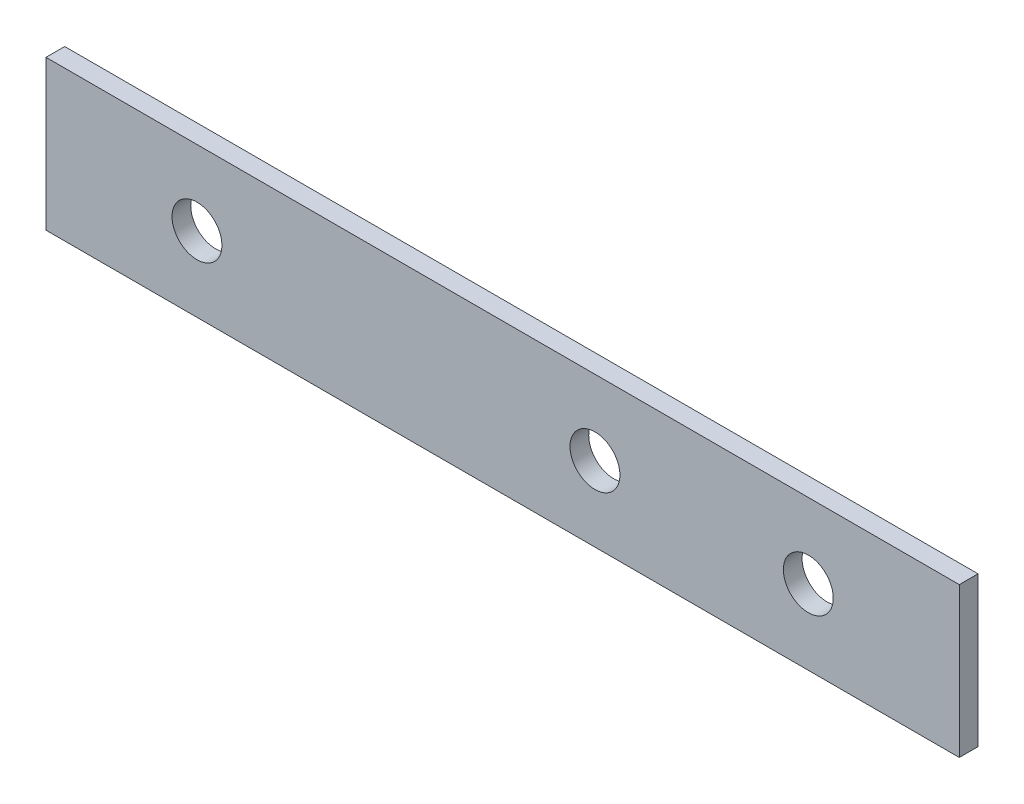
ISO-10303-21;
HEADER;
FILE_DESCRIPTION(('STEP AP214'),'2;1');
FILE_NAME('part.step','',(''),(''),'','','');
FILE_SCHEMA(('AUTOMOTIVE_DESIGN { 1 0 10303 214 1 1 1 1 }'));
ENDSEC;
DATA;
#1=APPLICATION_CONTEXT('core data for automotive mechanical design processes');
#2=APPLICATION_PROTOCOL_DEFINITION('international standard','automotive_design',2000,#1);
#3=PRODUCT_CONTEXT('',#1,'mechanical');
#4=PRODUCT('Part','Part','',(#3));
#5=PRODUCT_RELATED_PRODUCT_CATEGORY('part','',(#4));
#6=PRODUCT_DEFINITION_FORMATION('','',#4);
#7=PRODUCT_DEFINITION_CONTEXT('part definition',#1,'design');
#8=PRODUCT_DEFINITION('design','',#6,#7);
#9=PRODUCT_DEFINITION_SHAPE('','',#8);
#10=(LENGTH_UNIT() NAMED_UNIT(*) SI_UNIT(.MILLI.,.METRE.));
#11=(NAMED_UNIT(*) PLANE_ANGLE_UNIT() SI_UNIT($,.RADIAN.));
#12=(NAMED_UNIT(*) SI_UNIT($,.STERADIAN.) SOLID_ANGLE_UNIT());
#13=UNCERTAINTY_MEASURE_WITH_UNIT(LENGTH_MEASURE(1.E-05),#10,'distance_accuracy_value','');
#14=(GEOMETRIC_REPRESENTATION_CONTEXT(3) GLOBAL_UNCERTAINTY_ASSIGNED_CONTEXT((#13)) GLOBAL_UNIT_ASSIGNED_CONTEXT((#10,
#11,#12)) REPRESENTATION_CONTEXT('',''));
#15=CARTESIAN_POINT('',(0.,0.,0.));
#16=DIRECTION('',(0.,0.,1.));
#17=DIRECTION('',(1.,0.,0.));
#18=AXIS2_PLACEMENT_3D('',#15,#16,#17);
#19=CARTESIAN_POINT('',(0.,0.,4.7625));
#20=DIRECTION('',(0.,0.,-1.));
#21=DIRECTION('',(-1.,0.,0.));
#22=AXIS2_PLACEMENT_3D('',#19,#20,#21);
#23=PLANE('',#22);
#24=DIRECTION('',(0.,-1.,0.));
#25=VECTOR('',#24,1.);
#26=CARTESIAN_POINT('',(0.,0.,4.7625));
#27=LINE('',#26,#25);
#28=CARTESIAN_POINT('',(0.,38.1,4.7625));
#29=VERTEX_POINT('',#28);
#30=CARTESIAN_POINT('',(0.,0.,4.7625));
#31=VERTEX_POINT('',#30);
#32=EDGE_CURVE('E96',#29,#31,#27,.T.);
#33=ORIENTED_EDGE('',*,*,#32,.T.);
#34=DIRECTION('',(1.,0.,0.));
#35=VECTOR('',#34,1.);
#36=CARTESIAN_POINT('',(0.,0.,4.7625));
#37=LINE('',#36,#35);
#38=CARTESIAN_POINT('',(232.41,0.,4.7625));
#39=VERTEX_POINT('',#38);
#40=EDGE_CURVE('E91',#31,#39,#37,.T.);
#41=ORIENTED_EDGE('',*,*,#40,.T.);
#42=DIRECTION('',(0.,1.,0.));
#43=VECTOR('',#42,1.);
#44=CARTESIAN_POINT('',(232.41,0.,4.7625));
#45=LINE('',#44,#43);
#46=CARTESIAN_POINT('',(232.41,38.1,4.7625));
#47=VERTEX_POINT('',#46);
#48=EDGE_CURVE('E94',#39,#47,#45,.T.);
#49=ORIENTED_EDGE('',*,*,#48,.T.);
#50=DIRECTION('',(-1.,0.,0.));
#51=VECTOR('',#50,1.);
#52=CARTESIAN_POINT('',(0.,38.1,4.7625));
#53=LINE('',#52,#51);
#54=EDGE_CURVE('E61',#47,#29,#53,.T.);
#55=ORIENTED_EDGE('',*,*,#54,.T.);
#56=EDGE_LOOP('',(#33,#41,#49,#55));
#57=FACE_BOUND('',#56,.T.);
#58=CARTESIAN_POINT('',(38.4175,19.05,4.7625));
#59=DIRECTION('',(0.,0.,1.));
#60=DIRECTION('',(1.,0.,0.));
#61=AXIS2_PLACEMENT_3D('',#58,#59,#60);
#62=CIRCLE('',#61,6.35);
#63=CARTESIAN_POINT('',(32.0675,19.05,4.7625));
#64=VERTEX_POINT('',#63);
#65=EDGE_CURVE('E116',#64,#64,#62,.T.);
#66=ORIENTED_EDGE('',*,*,#65,.F.);
#67=EDGE_LOOP('',(#66));
#68=FACE_BOUND('',#67,.T.);
#69=CARTESIAN_POINT('',(193.9925,19.05,4.7625));
#70=DIRECTION('',(0.,0.,1.));
#71=DIRECTION('',(1.,0.,0.));
#72=AXIS2_PLACEMENT_3D('',#69,#70,#71);
#73=CIRCLE('',#72,6.35);
#74=CARTESIAN_POINT('',(187.6425,19.05,4.7625));
#75=VERTEX_POINT('',#74);
#76=EDGE_CURVE('E138',#75,#75,#73,.T.);
#77=ORIENTED_EDGE('',*,*,#76,.F.);
#78=EDGE_LOOP('',(#77));
#79=FACE_BOUND('',#78,.T.);
#80=CARTESIAN_POINT('',(139.7,19.05,4.7625));
#81=DIRECTION('',(0.,0.,1.));
#82=DIRECTION('',(1.,0.,0.));
#83=AXIS2_PLACEMENT_3D('',#80,#81,#82);
#84=CIRCLE('',#83,6.35);
#85=CARTESIAN_POINT('',(133.35,19.05,4.7625));
#86=VERTEX_POINT('',#85);
#87=EDGE_CURVE('E146',#86,#86,#84,.T.);
#88=ORIENTED_EDGE('',*,*,#87,.F.);
#89=EDGE_LOOP('',(#88));
#90=FACE_BOUND('',#89,.T.);
#91=ADVANCED_FACE('F43',(#57,#68,#79,#90),#23,.F.);
#92=CARTESIAN_POINT('',(0.,0.,0.));
#93=DIRECTION('',(0.,0.,-1.));
#94=DIRECTION('',(-1.,0.,0.));
#95=AXIS2_PLACEMENT_3D('',#92,#93,#94);
#96=PLANE('',#95);
#97=CARTESIAN_POINT('',(193.9925,19.05,0.));
#98=DIRECTION('',(0.,0.,1.));
#99=DIRECTION('',(1.,0.,0.));
#100=AXIS2_PLACEMENT_3D('',#97,#98,#99);
#101=CIRCLE('',#100,6.35);
#102=CARTESIAN_POINT('',(187.6425,19.05,0.));
#103=VERTEX_POINT('',#102);
#104=EDGE_CURVE('E142',#103,#103,#101,.T.);
#105=ORIENTED_EDGE('',*,*,#104,.T.);
#106=EDGE_LOOP('',(#105));
#107=FACE_BOUND('',#106,.T.);
#108=DIRECTION('',(0.,-1.,0.));
#109=VECTOR('',#108,1.);
#110=CARTESIAN_POINT('',(0.,0.,0.));
#111=LINE('',#110,#109);
#112=CARTESIAN_POINT('',(0.,38.1,0.));
#113=VERTEX_POINT('',#112);
#114=CARTESIAN_POINT('',(0.,0.,0.));
#115=VERTEX_POINT('',#114);
#116=EDGE_CURVE('E112',#113,#115,#111,.T.);
#117=ORIENTED_EDGE('',*,*,#116,.F.);
#118=DIRECTION('',(-1.,0.,0.));
#119=VECTOR('',#118,1.);
#120=CARTESIAN_POINT('',(0.,38.1,0.));
#121=LINE('',#120,#119);
#122=CARTESIAN_POINT('',(232.41,38.1,0.));
#123=VERTEX_POINT('',#122);
#124=EDGE_CURVE('E84',#123,#113,#121,.T.);
#125=ORIENTED_EDGE('',*,*,#124,.F.);
#126=DIRECTION('',(0.,1.,0.));
#127=VECTOR('',#126,1.);
#128=CARTESIAN_POINT('',(232.41,0.,0.));
#129=LINE('',#128,#127);
#130=CARTESIAN_POINT('',(232.41,0.,0.));
#131=VERTEX_POINT('',#130);
#132=EDGE_CURVE('E78',#131,#123,#129,.T.);
#133=ORIENTED_EDGE('',*,*,#132,.F.);
#134=DIRECTION('',(1.,0.,0.));
#135=VECTOR('',#134,1.);
#136=CARTESIAN_POINT('',(0.,0.,0.));
#137=LINE('',#136,#135);
#138=EDGE_CURVE('E101',#115,#131,#137,.T.);
#139=ORIENTED_EDGE('',*,*,#138,.F.);
#140=EDGE_LOOP('',(#117,#125,#133,#139));
#141=FACE_BOUND('',#140,.T.);
#142=CARTESIAN_POINT('',(38.4175,19.05,0.));
#143=DIRECTION('',(0.,0.,1.));
#144=DIRECTION('',(1.,0.,0.));
#145=AXIS2_PLACEMENT_3D('',#142,#143,#144);
#146=CIRCLE('',#145,6.35);
#147=CARTESIAN_POINT('',(32.0675,19.05,0.));
#148=VERTEX_POINT('',#147);
#149=EDGE_CURVE('E134',#148,#148,#146,.T.);
#150=ORIENTED_EDGE('',*,*,#149,.T.);
#151=EDGE_LOOP('',(#150));
#152=FACE_BOUND('',#151,.T.);
#153=CARTESIAN_POINT('',(139.7,19.05,0.));
#154=DIRECTION('',(0.,0.,1.));
#155=DIRECTION('',(1.,0.,0.));
#156=AXIS2_PLACEMENT_3D('',#153,#154,#155);
#157=CIRCLE('',#156,6.35);
#158=CARTESIAN_POINT('',(133.35,19.05,0.));
#159=VERTEX_POINT('',#158);
#160=EDGE_CURVE('E150',#159,#159,#157,.T.);
#161=ORIENTED_EDGE('',*,*,#160,.T.);
#162=EDGE_LOOP('',(#161));
#163=FACE_BOUND('',#162,.T.);
#164=ADVANCED_FACE('F129',(#107,#141,#152,#163),#96,.T.);
#165=CARTESIAN_POINT('',(0.,0.,4.7625));
#166=DIRECTION('',(1.,0.,0.));
#167=DIRECTION('',(0.,0.,-1.));
#168=AXIS2_PLACEMENT_3D('',#165,#166,#167);
#169=PLANE('',#168);
#170=ORIENTED_EDGE('',*,*,#116,.T.);
#171=DIRECTION('',(0.,0.,-1.));
#172=VECTOR('',#171,1.);
#173=CARTESIAN_POINT('',(0.,0.,4.7625));
#174=LINE('',#173,#172);
#175=EDGE_CURVE('E11',#31,#115,#174,.T.);
#176=ORIENTED_EDGE('',*,*,#175,.F.);
#177=ORIENTED_EDGE('',*,*,#32,.F.);
#178=DIRECTION('',(0.,0.,-1.));
#179=VECTOR('',#178,1.);
#180=CARTESIAN_POINT('',(0.,38.1,4.7625));
#181=LINE('',#180,#179);
#182=EDGE_CURVE('E108',#29,#113,#181,.T.);
#183=ORIENTED_EDGE('',*,*,#182,.T.);
#184=EDGE_LOOP('',(#170,#176,#177,#183));
#185=FACE_BOUND('',#184,.T.);
#186=ADVANCED_FACE('F45',(#185),#169,.F.);
#187=CARTESIAN_POINT('',(0.,0.,4.7625));
#188=DIRECTION('',(0.,1.,0.));
#189=DIRECTION('',(0.,0.,1.));
#190=AXIS2_PLACEMENT_3D('',#187,#188,#189);
#191=PLANE('',#190);
#192=ORIENTED_EDGE('',*,*,#138,.T.);
#193=DIRECTION('',(0.,0.,-1.));
#194=VECTOR('',#193,1.);
#195=CARTESIAN_POINT('',(232.41,0.,4.7625));
#196=LINE('',#195,#194);
#197=EDGE_CURVE('E53',#39,#131,#196,.T.);
#198=ORIENTED_EDGE('',*,*,#197,.F.);
#199=ORIENTED_EDGE('',*,*,#40,.F.);
#200=ORIENTED_EDGE('',*,*,#175,.T.);
#201=EDGE_LOOP('',(#192,#198,#199,#200));
#202=FACE_BOUND('',#201,.T.);
#203=ADVANCED_FACE('F100',(#202),#191,.F.);
#204=CARTESIAN_POINT('',(232.41,0.,4.7625));
#205=DIRECTION('',(-1.,0.,0.));
#206=DIRECTION('',(0.,0.,1.));
#207=AXIS2_PLACEMENT_3D('',#204,#205,#206);
#208=PLANE('',#207);
#209=ORIENTED_EDGE('',*,*,#132,.T.);
#210=DIRECTION('',(0.,0.,-1.));
#211=VECTOR('',#210,1.);
#212=CARTESIAN_POINT('',(232.41,38.1,4.7625));
#213=LINE('',#212,#211);
#214=EDGE_CURVE('E103',#47,#123,#213,.T.);
#215=ORIENTED_EDGE('',*,*,#214,.F.);
#216=ORIENTED_EDGE('',*,*,#48,.F.);
#217=ORIENTED_EDGE('',*,*,#197,.T.);
#218=EDGE_LOOP('',(#209,#215,#216,#217));
#219=FACE_BOUND('',#218,.T.);
#220=ADVANCED_FACE('F104',(#219),#208,.F.);
#221=CARTESIAN_POINT('',(0.,38.1,4.7625));
#222=DIRECTION('',(0.,-1.,0.));
#223=DIRECTION('',(0.,0.,-1.));
#224=AXIS2_PLACEMENT_3D('',#221,#222,#223);
#225=PLANE('',#224);
#226=ORIENTED_EDGE('',*,*,#124,.T.);
#227=ORIENTED_EDGE('',*,*,#182,.F.);
#228=ORIENTED_EDGE('',*,*,#54,.F.);
#229=ORIENTED_EDGE('',*,*,#214,.T.);
#230=EDGE_LOOP('',(#226,#227,#228,#229));
#231=FACE_BOUND('',#230,.T.);
#232=ADVANCED_FACE('F126',(#231),#225,.F.);
#233=CARTESIAN_POINT('',(38.4175,19.05,4.7625));
#234=DIRECTION('',(0.,0.,-1.));
#235=DIRECTION('',(-1.,0.,0.));
#236=AXIS2_PLACEMENT_3D('',#233,#234,#235);
#237=CYLINDRICAL_SURFACE('',#236,6.35);
#238=CARTESIAN_POINT('',(32.0675,19.05,4.7625));
#239=CARTESIAN_POINT('',(32.0675,19.05,4.712890625));
#240=CARTESIAN_POINT('',(32.0675,19.05,4.66328125));
#241=CARTESIAN_POINT('',(32.0675,19.05,4.5640625));
#242=CARTESIAN_POINT('',(32.0675,19.05,4.514453125));
#243=CARTESIAN_POINT('',(32.0675,19.05,4.415234375));
#244=CARTESIAN_POINT('',(32.0675,19.05,4.365625));
#245=CARTESIAN_POINT('',(32.0675,19.05,4.26640625));
#246=CARTESIAN_POINT('',(32.0675,19.05,4.216796875));
#247=CARTESIAN_POINT('',(32.0675,19.05,4.117578125));
#248=CARTESIAN_POINT('',(32.0675,19.05,4.06796875));
#249=CARTESIAN_POINT('',(32.0675,19.05,3.96875));
#250=CARTESIAN_POINT('',(32.0675,19.05,3.919140625));
#251=CARTESIAN_POINT('',(32.0675,19.05,3.819921875));
#252=CARTESIAN_POINT('',(32.0675,19.05,3.7703125));
#253=CARTESIAN_POINT('',(32.0675,19.05,3.67109375));
#254=CARTESIAN_POINT('',(32.0675,19.05,3.621484375));
#255=CARTESIAN_POINT('',(32.0675,19.05,3.522265625));
#256=CARTESIAN_POINT('',(32.0675,19.05,3.47265625));
#257=CARTESIAN_POINT('',(32.0675,19.05,3.3734375));
#258=CARTESIAN_POINT('',(32.0675,19.05,3.323828125));
#259=CARTESIAN_POINT('',(32.0675,19.05,3.224609375));
#260=CARTESIAN_POINT('',(32.0675,19.05,3.175));
#261=CARTESIAN_POINT('',(32.0675,19.05,3.07578125));
#262=CARTESIAN_POINT('',(32.0675,19.05,3.026171875));
#263=CARTESIAN_POINT('',(32.0675,19.05,2.926953125));
#264=CARTESIAN_POINT('',(32.0675,19.05,2.87734375));
#265=CARTESIAN_POINT('',(32.0675,19.05,2.778125));
#266=CARTESIAN_POINT('',(32.0675,19.05,2.728515625));
#267=CARTESIAN_POINT('',(32.0675,19.05,2.629296875));
#268=CARTESIAN_POINT('',(32.0675,19.05,2.5796875));
#269=CARTESIAN_POINT('',(32.0675,19.05,2.48046875));
#270=CARTESIAN_POINT('',(32.0675,19.05,2.430859375));
#271=CARTESIAN_POINT('',(32.0675,19.05,2.331640625));
#272=CARTESIAN_POINT('',(32.0675,19.05,2.28203125));
#273=CARTESIAN_POINT('',(32.0675,19.05,2.1828125));
#274=CARTESIAN_POINT('',(32.0675,19.05,2.133203125));
#275=CARTESIAN_POINT('',(32.0675,19.05,2.033984375));
#276=CARTESIAN_POINT('',(32.0675,19.05,1.984375));
#277=CARTESIAN_POINT('',(32.0675,19.05,1.88515625));
#278=CARTESIAN_POINT('',(32.0675,19.05,1.835546875));
#279=CARTESIAN_POINT('',(32.0675,19.05,1.736328125));
#280=CARTESIAN_POINT('',(32.0675,19.05,1.68671875));
#281=CARTESIAN_POINT('',(32.0675,19.05,1.5875));
#282=CARTESIAN_POINT('',(32.0675,19.05,1.537890625));
#283=CARTESIAN_POINT('',(32.0675,19.05,1.438671875));
#284=CARTESIAN_POINT('',(32.0675,19.05,1.3890625));
#285=CARTESIAN_POINT('',(32.0675,19.05,1.28984375));
#286=CARTESIAN_POINT('',(32.0675,19.05,1.240234375));
#287=CARTESIAN_POINT('',(32.0675,19.05,1.141015625));
#288=CARTESIAN_POINT('',(32.0675,19.05,1.09140625));
#289=CARTESIAN_POINT('',(32.0675,19.05,0.992187499999999));
#290=CARTESIAN_POINT('',(32.0675,19.05,0.942578124999999));
#291=CARTESIAN_POINT('',(32.0675,19.05,0.843359375));
#292=CARTESIAN_POINT('',(32.0675,19.05,0.79375));
#293=CARTESIAN_POINT('',(32.0675,19.05,0.69453125));
#294=CARTESIAN_POINT('',(32.0675,19.05,0.644921875));
#295=CARTESIAN_POINT('',(32.0675,19.05,0.545703125));
#296=CARTESIAN_POINT('',(32.0675,19.05,0.49609375));
#297=CARTESIAN_POINT('',(32.0675,19.05,0.396875));
#298=CARTESIAN_POINT('',(32.0675,19.05,0.347265625));
#299=CARTESIAN_POINT('',(32.0675,19.05,0.248046875));
#300=CARTESIAN_POINT('',(32.0675,19.05,0.1984375));
#301=CARTESIAN_POINT('',(32.0675,19.05,0.09921875));
#302=CARTESIAN_POINT('',(32.0675,19.05,0.049609375));
#303=CARTESIAN_POINT('',(32.0675,19.05,0.));
#304=B_SPLINE_CURVE_WITH_KNOTS('',3,(#238,#239,#240,#241,#242,#243,#244,#245,#246,#247,#248,
#249,#250,#251,#252,#253,#254,#255,#256,#257,#258,#259,#260,#261,#262,#263,#264,#265,#266,#267,
#268,#269,#270,#271,#272,#273,#274,#275,#276,#277,#278,#279,#280,#281,#282,#283,#284,#285,#286,
#287,#288,#289,#290,#291,#292,#293,#294,#295,#296,#297,#298,#299,#300,#301,#302,#303),
.UNSPECIFIED.,.F.,.F.,(4,2,2,2,2,2,2,2,2,2,2,2,2,2,2,2,2,2,2,2,2,2,2,2,2,2,2,2,2,2,2,2,4),(0.,
0.148828125,0.29765625,0.446484375,0.5953125,0.744140625,0.892968750000001,1.041796875,1.190625,
1.339453125,1.48828125,1.637109375,1.7859375,1.934765625,2.08359375,2.232421875,2.38125,
2.530078125,2.67890625,2.827734375,2.9765625,3.125390625,3.27421875,3.423046875,3.571875,
3.720703125,3.86953125,4.018359375,4.1671875,4.316015625,4.46484375,4.613671875,4.7625),.UNSPECIFIED.);
#305=EDGE_CURVE('BSEAM169',#64,#148,#304,.T.);
#306=ORIENTED_EDGE('',*,*,#65,.T.);
#307=ORIENTED_EDGE('',*,*,#149,.F.);
#308=ORIENTED_EDGE('',*,*,#305,.T.);
#309=ORIENTED_EDGE('',*,*,#305,.F.);
#310=EDGE_LOOP('',(#306,#308,#307,#309));
#311=FACE_BOUND('',#310,.T.);
#312=ADVANCED_FACE('F169',(#311),#237,.F.);
#313=CARTESIAN_POINT('',(193.9925,19.05,4.7625));
#314=DIRECTION('',(0.,0.,-1.));
#315=DIRECTION('',(-1.,0.,0.));
#316=AXIS2_PLACEMENT_3D('',#313,#314,#315);
#317=CYLINDRICAL_SURFACE('',#316,6.35);
#318=CARTESIAN_POINT('',(187.6425,19.05,4.7625));
#319=CARTESIAN_POINT('',(187.6425,19.05,4.712890625));
#320=CARTESIAN_POINT('',(187.6425,19.05,4.66328125));
#321=CARTESIAN_POINT('',(187.6425,19.05,4.5640625));
#322=CARTESIAN_POINT('',(187.6425,19.05,4.514453125));
#323=CARTESIAN_POINT('',(187.6425,19.05,4.415234375));
#324=CARTESIAN_POINT('',(187.6425,19.05,4.365625));
#325=CARTESIAN_POINT('',(187.6425,19.05,4.26640625));
#326=CARTESIAN_POINT('',(187.6425,19.05,4.216796875));
#327=CARTESIAN_POINT('',(187.6425,19.05,4.117578125));
#328=CARTESIAN_POINT('',(187.6425,19.05,4.06796875));
#329=CARTESIAN_POINT('',(187.6425,19.05,3.96875));
#330=CARTESIAN_POINT('',(187.6425,19.05,3.919140625));
#331=CARTESIAN_POINT('',(187.6425,19.05,3.819921875));
#332=CARTESIAN_POINT('',(187.6425,19.05,3.7703125));
#333=CARTESIAN_POINT('',(187.6425,19.05,3.67109375));
#334=CARTESIAN_POINT('',(187.6425,19.05,3.621484375));
#335=CARTESIAN_POINT('',(187.6425,19.05,3.522265625));
#336=CARTESIAN_POINT('',(187.6425,19.05,3.47265625));
#337=CARTESIAN_POINT('',(187.6425,19.05,3.3734375));
#338=CARTESIAN_POINT('',(187.6425,19.05,3.323828125));
#339=CARTESIAN_POINT('',(187.6425,19.05,3.224609375));
#340=CARTESIAN_POINT('',(187.6425,19.05,3.175));
#341=CARTESIAN_POINT('',(187.6425,19.05,3.07578125));
#342=CARTESIAN_POINT('',(187.6425,19.05,3.026171875));
#343=CARTESIAN_POINT('',(187.6425,19.05,2.926953125));
#344=CARTESIAN_POINT('',(187.6425,19.05,2.87734375));
#345=CARTESIAN_POINT('',(187.6425,19.05,2.778125));
#346=CARTESIAN_POINT('',(187.6425,19.05,2.728515625));
#347=CARTESIAN_POINT('',(187.6425,19.05,2.629296875));
#348=CARTESIAN_POINT('',(187.6425,19.05,2.5796875));
#349=CARTESIAN_POINT('',(187.6425,19.05,2.48046875));
#350=CARTESIAN_POINT('',(187.6425,19.05,2.430859375));
#351=CARTESIAN_POINT('',(187.6425,19.05,2.331640625));
#352=CARTESIAN_POINT('',(187.6425,19.05,2.28203125));
#353=CARTESIAN_POINT('',(187.6425,19.05,2.1828125));
#354=CARTESIAN_POINT('',(187.6425,19.05,2.133203125));
#355=CARTESIAN_POINT('',(187.6425,19.05,2.033984375));
#356=CARTESIAN_POINT('',(187.6425,19.05,1.984375));
#357=CARTESIAN_POINT('',(187.6425,19.05,1.88515625));
#358=CARTESIAN_POINT('',(187.6425,19.05,1.835546875));
#359=CARTESIAN_POINT('',(187.6425,19.05,1.736328125));
#360=CARTESIAN_POINT('',(187.6425,19.05,1.68671875));
#361=CARTESIAN_POINT('',(187.6425,19.05,1.5875));
#362=CARTESIAN_POINT('',(187.6425,19.05,1.537890625));
#363=CARTESIAN_POINT('',(187.6425,19.05,1.438671875));
#364=CARTESIAN_POINT('',(187.6425,19.05,1.3890625));
#365=CARTESIAN_POINT('',(187.6425,19.05,1.28984375));
#366=CARTESIAN_POINT('',(187.6425,19.05,1.240234375));
#367=CARTESIAN_POINT('',(187.6425,19.05,1.141015625));
#368=CARTESIAN_POINT('',(187.6425,19.05,1.09140625));
#369=CARTESIAN_POINT('',(187.6425,19.05,0.992187499999999));
#370=CARTESIAN_POINT('',(187.6425,19.05,0.942578124999999));
#371=CARTESIAN_POINT('',(187.6425,19.05,0.843359375));
#372=CARTESIAN_POINT('',(187.6425,19.05,0.79375));
#373=CARTESIAN_POINT('',(187.6425,19.05,0.69453125));
#374=CARTESIAN_POINT('',(187.6425,19.05,0.644921875));
#375=CARTESIAN_POINT('',(187.6425,19.05,0.545703125));
#376=CARTESIAN_POINT('',(187.6425,19.05,0.49609375));
#377=CARTESIAN_POINT('',(187.6425,19.05,0.396875));
#378=CARTESIAN_POINT('',(187.6425,19.05,0.347265625));
#379=CARTESIAN_POINT('',(187.6425,19.05,0.248046875));
#380=CARTESIAN_POINT('',(187.6425,19.05,0.1984375));
#381=CARTESIAN_POINT('',(187.6425,19.05,0.09921875));
#382=CARTESIAN_POINT('',(187.6425,19.05,0.049609375));
#383=CARTESIAN_POINT('',(187.6425,19.05,0.));
#384=B_SPLINE_CURVE_WITH_KNOTS('',3,(#318,#319,#320,#321,#322,#323,#324,#325,#326,#327,#328,
#329,#330,#331,#332,#333,#334,#335,#336,#337,#338,#339,#340,#341,#342,#343,#344,#345,#346,#347,
#348,#349,#350,#351,#352,#353,#354,#355,#356,#357,#358,#359,#360,#361,#362,#363,#364,#365,#366,
#367,#368,#369,#370,#371,#372,#373,#374,#375,#376,#377,#378,#379,#380,#381,#382,#383),
.UNSPECIFIED.,.F.,.F.,(4,2,2,2,2,2,2,2,2,2,2,2,2,2,2,2,2,2,2,2,2,2,2,2,2,2,2,2,2,2,2,2,4),(0.,
0.148828125,0.29765625,0.446484375,0.5953125,0.744140625,0.892968750000001,1.041796875,1.190625,
1.339453125,1.48828125,1.637109375,1.7859375,1.934765625,2.08359375,2.232421875,2.38125,
2.530078125,2.67890625,2.827734375,2.9765625,3.125390625,3.27421875,3.423046875,3.571875,
3.720703125,3.86953125,4.018359375,4.1671875,4.316015625,4.46484375,4.613671875,4.7625),.UNSPECIFIED.);
#385=EDGE_CURVE('BSEAM223',#75,#103,#384,.T.);
#386=ORIENTED_EDGE('',*,*,#76,.T.);
#387=ORIENTED_EDGE('',*,*,#104,.F.);
#388=ORIENTED_EDGE('',*,*,#385,.T.);
#389=ORIENTED_EDGE('',*,*,#385,.F.);
#390=EDGE_LOOP('',(#386,#388,#387,#389));
#391=FACE_BOUND('',#390,.T.);
#392=ADVANCED_FACE('F223',(#391),#317,.F.);
#393=CARTESIAN_POINT('',(139.7,19.05,4.7625));
#394=DIRECTION('',(0.,0.,-1.));
#395=DIRECTION('',(-1.,0.,0.));
#396=AXIS2_PLACEMENT_3D('',#393,#394,#395);
#397=CYLINDRICAL_SURFACE('',#396,6.35);
#398=CARTESIAN_POINT('',(133.35,19.05,4.7625));
#399=CARTESIAN_POINT('',(133.35,19.05,4.712890625));
#400=CARTESIAN_POINT('',(133.35,19.05,4.66328125));
#401=CARTESIAN_POINT('',(133.35,19.05,4.5640625));
#402=CARTESIAN_POINT('',(133.35,19.05,4.514453125));
#403=CARTESIAN_POINT('',(133.35,19.05,4.415234375));
#404=CARTESIAN_POINT('',(133.35,19.05,4.365625));
#405=CARTESIAN_POINT('',(133.35,19.05,4.26640625));
#406=CARTESIAN_POINT('',(133.35,19.05,4.216796875));
#407=CARTESIAN_POINT('',(133.35,19.05,4.117578125));
#408=CARTESIAN_POINT('',(133.35,19.05,4.06796875));
#409=CARTESIAN_POINT('',(133.35,19.05,3.96875));
#410=CARTESIAN_POINT('',(133.35,19.05,3.919140625));
#411=CARTESIAN_POINT('',(133.35,19.05,3.819921875));
#412=CARTESIAN_POINT('',(133.35,19.05,3.7703125));
#413=CARTESIAN_POINT('',(133.35,19.05,3.67109375));
#414=CARTESIAN_POINT('',(133.35,19.05,3.621484375));
#415=CARTESIAN_POINT('',(133.35,19.05,3.522265625));
#416=CARTESIAN_POINT('',(133.35,19.05,3.47265625));
#417=CARTESIAN_POINT('',(133.35,19.05,3.3734375));
#418=CARTESIAN_POINT('',(133.35,19.05,3.323828125));
#419=CARTESIAN_POINT('',(133.35,19.05,3.224609375));
#420=CARTESIAN_POINT('',(133.35,19.05,3.175));
#421=CARTESIAN_POINT('',(133.35,19.05,3.07578125));
#422=CARTESIAN_POINT('',(133.35,19.05,3.026171875));
#423=CARTESIAN_POINT('',(133.35,19.05,2.926953125));
#424=CARTESIAN_POINT('',(133.35,19.05,2.87734375));
#425=CARTESIAN_POINT('',(133.35,19.05,2.778125));
#426=CARTESIAN_POINT('',(133.35,19.05,2.728515625));
#427=CARTESIAN_POINT('',(133.35,19.05,2.629296875));
#428=CARTESIAN_POINT('',(133.35,19.05,2.5796875));
#429=CARTESIAN_POINT('',(133.35,19.05,2.48046875));
#430=CARTESIAN_POINT('',(133.35,19.05,2.430859375));
#431=CARTESIAN_POINT('',(133.35,19.05,2.331640625));
#432=CARTESIAN_POINT('',(133.35,19.05,2.28203125));
#433=CARTESIAN_POINT('',(133.35,19.05,2.1828125));
#434=CARTESIAN_POINT('',(133.35,19.05,2.133203125));
#435=CARTESIAN_POINT('',(133.35,19.05,2.033984375));
#436=CARTESIAN_POINT('',(133.35,19.05,1.984375));
#437=CARTESIAN_POINT('',(133.35,19.05,1.88515625));
#438=CARTESIAN_POINT('',(133.35,19.05,1.835546875));
#439=CARTESIAN_POINT('',(133.35,19.05,1.736328125));
#440=CARTESIAN_POINT('',(133.35,19.05,1.68671875));
#441=CARTESIAN_POINT('',(133.35,19.05,1.5875));
#442=CARTESIAN_POINT('',(133.35,19.05,1.537890625));
#443=CARTESIAN_POINT('',(133.35,19.05,1.438671875));
#444=CARTESIAN_POINT('',(133.35,19.05,1.3890625));
#445=CARTESIAN_POINT('',(133.35,19.05,1.28984375));
#446=CARTESIAN_POINT('',(133.35,19.05,1.240234375));
#447=CARTESIAN_POINT('',(133.35,19.05,1.141015625));
#448=CARTESIAN_POINT('',(133.35,19.05,1.09140625));
#449=CARTESIAN_POINT('',(133.35,19.05,0.992187499999999));
#450=CARTESIAN_POINT('',(133.35,19.05,0.942578124999999));
#451=CARTESIAN_POINT('',(133.35,19.05,0.843359375));
#452=CARTESIAN_POINT('',(133.35,19.05,0.79375));
#453=CARTESIAN_POINT('',(133.35,19.05,0.69453125));
#454=CARTESIAN_POINT('',(133.35,19.05,0.644921875));
#455=CARTESIAN_POINT('',(133.35,19.05,0.545703125));
#456=CARTESIAN_POINT('',(133.35,19.05,0.49609375));
#457=CARTESIAN_POINT('',(133.35,19.05,0.396875));
#458=CARTESIAN_POINT('',(133.35,19.05,0.347265625));
#459=CARTESIAN_POINT('',(133.35,19.05,0.248046875));
#460=CARTESIAN_POINT('',(133.35,19.05,0.1984375));
#461=CARTESIAN_POINT('',(133.35,19.05,0.09921875));
#462=CARTESIAN_POINT('',(133.35,19.05,0.049609375));
#463=CARTESIAN_POINT('',(133.35,19.05,0.));
#464=B_SPLINE_CURVE_WITH_KNOTS('',3,(#398,#399,#400,#401,#402,#403,#404,#405,#406,#407,#408,
#409,#410,#411,#412,#413,#414,#415,#416,#417,#418,#419,#420,#421,#422,#423,#424,#425,#426,#427,
#428,#429,#430,#431,#432,#433,#434,#435,#436,#437,#438,#439,#440,#441,#442,#443,#444,#445,#446,
#447,#448,#449,#450,#451,#452,#453,#454,#455,#456,#457,#458,#459,#460,#461,#462,#463),
.UNSPECIFIED.,.F.,.F.,(4,2,2,2,2,2,2,2,2,2,2,2,2,2,2,2,2,2,2,2,2,2,2,2,2,2,2,2,2,2,2,2,4),(0.,
0.148828125,0.29765625,0.446484375,0.5953125,0.744140625,0.892968750000001,1.041796875,1.190625,
1.339453125,1.48828125,1.637109375,1.7859375,1.934765625,2.08359375,2.232421875,2.38125,
2.530078125,2.67890625,2.827734375,2.9765625,3.125390625,3.27421875,3.423046875,3.571875,
3.720703125,3.86953125,4.018359375,4.1671875,4.316015625,4.46484375,4.613671875,4.7625),.UNSPECIFIED.);
#465=EDGE_CURVE('BSEAM158',#86,#159,#464,.T.);
#466=ORIENTED_EDGE('',*,*,#87,.T.);
#467=ORIENTED_EDGE('',*,*,#160,.F.);
#468=ORIENTED_EDGE('',*,*,#465,.T.);
#469=ORIENTED_EDGE('',*,*,#465,.F.);
#470=EDGE_LOOP('',(#466,#468,#467,#469));
#471=FACE_BOUND('',#470,.T.);
#472=ADVANCED_FACE('F158',(#471),#397,.F.);
#473=CLOSED_SHELL('',(#91,#164,#186,#203,#220,#232,#312,#392,#472));
#474=MANIFOLD_SOLID_BREP('B2',#473);
#475=ADVANCED_BREP_SHAPE_REPRESENTATION('',(#18,#474),#14);
#476=SHAPE_DEFINITION_REPRESENTATION(#9,#475);
ENDSEC;
END-ISO-10303-21;
